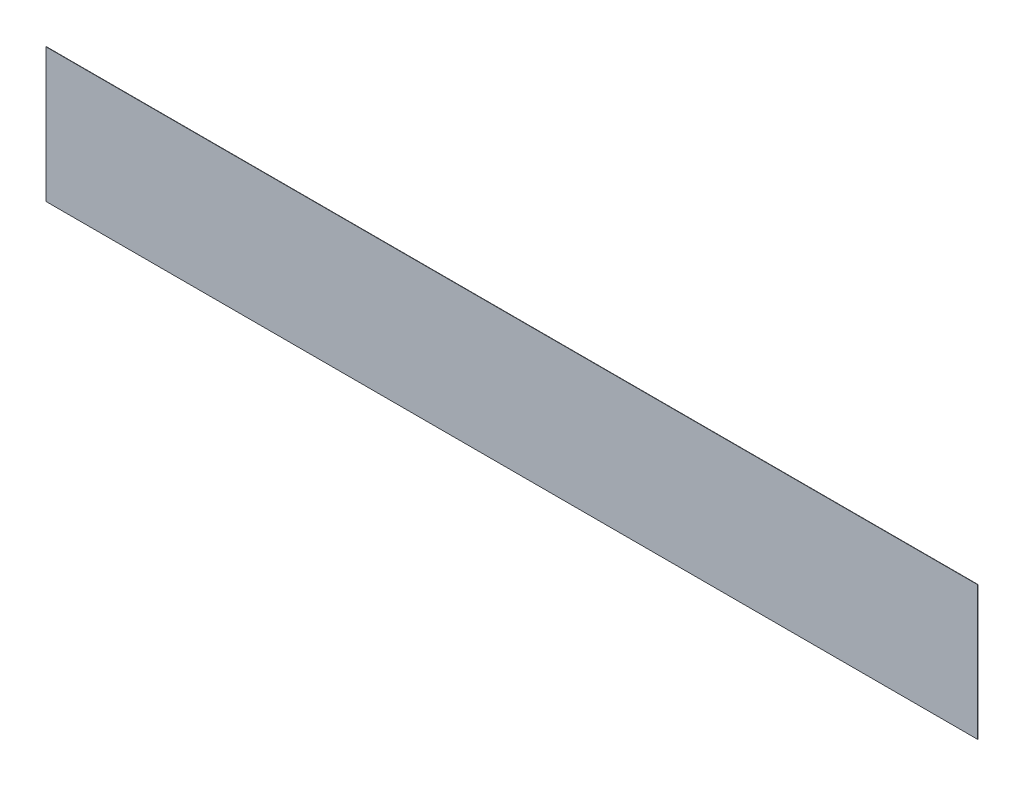
ISO-10303-21;
HEADER;
FILE_DESCRIPTION(('STEP AP214'),'2;1');
FILE_NAME('part.step','',(''),(''),'','','');
FILE_SCHEMA(('AUTOMOTIVE_DESIGN { 1 0 10303 214 1 1 1 1 }'));
ENDSEC;
DATA;
#1=APPLICATION_CONTEXT('core data for automotive mechanical design processes');
#2=APPLICATION_PROTOCOL_DEFINITION('international standard','automotive_design',2000,#1);
#3=PRODUCT_CONTEXT('',#1,'mechanical');
#4=PRODUCT('Part','Part','',(#3));
#5=PRODUCT_RELATED_PRODUCT_CATEGORY('part','',(#4));
#6=PRODUCT_DEFINITION_FORMATION('','',#4);
#7=PRODUCT_DEFINITION_CONTEXT('part definition',#1,'design');
#8=PRODUCT_DEFINITION('design','',#6,#7);
#9=PRODUCT_DEFINITION_SHAPE('','',#8);
#10=(LENGTH_UNIT() NAMED_UNIT(*) SI_UNIT(.MILLI.,.METRE.));
#11=(NAMED_UNIT(*) PLANE_ANGLE_UNIT() SI_UNIT($,.RADIAN.));
#12=(NAMED_UNIT(*) SI_UNIT($,.STERADIAN.) SOLID_ANGLE_UNIT());
#13=UNCERTAINTY_MEASURE_WITH_UNIT(LENGTH_MEASURE(1.E-05),#10,'distance_accuracy_value','');
#14=(GEOMETRIC_REPRESENTATION_CONTEXT(3) GLOBAL_UNCERTAINTY_ASSIGNED_CONTEXT((#13)) GLOBAL_UNIT_ASSIGNED_CONTEXT((#10,
#11,#12)) REPRESENTATION_CONTEXT('',''));
#15=CARTESIAN_POINT('',(0.,0.,0.));
#16=DIRECTION('',(0.,0.,1.));
#17=DIRECTION('',(1.,0.,0.));
#18=AXIS2_PLACEMENT_3D('',#15,#16,#17);
#19=CARTESIAN_POINT('',(0.,-9.78000000000001,0.05));
#20=DIRECTION('',(0.,1.,0.));
#21=DIRECTION('',(-1.,0.,0.));
#22=AXIS2_PLACEMENT_3D('',#19,#20,#21);
#23=PLANE('',#22);
#24=DIRECTION('',(1.,0.,0.));
#25=VECTOR('',#24,1.);
#26=CARTESIAN_POINT('',(0.,-9.78000000000001,0.));
#27=LINE('',#26,#25);
#28=CARTESIAN_POINT('',(-4.5,-9.78,0.));
#29=VERTEX_POINT('',#28);
#30=CARTESIAN_POINT('',(131.52,-9.77999999999999,0.));
#31=VERTEX_POINT('',#30);
#32=EDGE_CURVE('E100',#29,#31,#27,.T.);
#33=ORIENTED_EDGE('',*,*,#32,.T.);
#34=DIRECTION('',(0.,0.,-1.));
#35=VECTOR('',#34,1.);
#36=CARTESIAN_POINT('',(131.52,-9.77999999999999,0.05));
#37=LINE('',#36,#35);
#38=CARTESIAN_POINT('',(131.52,-9.77999999999999,0.05));
#39=VERTEX_POINT('',#38);
#40=EDGE_CURVE('E12',#39,#31,#37,.T.);
#41=ORIENTED_EDGE('',*,*,#40,.F.);
#42=DIRECTION('',(1.,0.,0.));
#43=VECTOR('',#42,1.);
#44=CARTESIAN_POINT('',(0.,-9.78000000000001,0.05));
#45=LINE('',#44,#43);
#46=CARTESIAN_POINT('',(-4.5,-9.78,0.05));
#47=VERTEX_POINT('',#46);
#48=EDGE_CURVE('E112',#47,#39,#45,.T.);
#49=ORIENTED_EDGE('',*,*,#48,.F.);
#50=DIRECTION('',(0.,0.,-1.));
#51=VECTOR('',#50,1.);
#52=CARTESIAN_POINT('',(-4.5,-9.78,0.05));
#53=LINE('',#52,#51);
#54=EDGE_CURVE('E66',#47,#29,#53,.T.);
#55=ORIENTED_EDGE('',*,*,#54,.T.);
#56=EDGE_LOOP('',(#33,#41,#49,#55));
#57=FACE_BOUND('',#56,.T.);
#58=ADVANCED_FACE('F62',(#57),#23,.F.);
#59=CARTESIAN_POINT('',(131.52,0.,0.05));
#60=DIRECTION('',(1.,0.,0.));
#61=DIRECTION('',(0.,0.,-1.));
#62=AXIS2_PLACEMENT_3D('',#59,#60,#61);
#63=PLANE('',#62);
#64=DIRECTION('',(0.,-1.,0.));
#65=VECTOR('',#64,1.);
#66=CARTESIAN_POINT('',(131.52,0.,0.));
#67=LINE('',#66,#65);
#68=CARTESIAN_POINT('',(131.52,9.78000000000001,0.));
#69=VERTEX_POINT('',#68);
#70=EDGE_CURVE('E113',#69,#31,#67,.T.);
#71=ORIENTED_EDGE('',*,*,#70,.F.);
#72=DIRECTION('',(0.,0.,-1.));
#73=VECTOR('',#72,1.);
#74=CARTESIAN_POINT('',(131.52,9.78000000000001,0.05));
#75=LINE('',#74,#73);
#76=CARTESIAN_POINT('',(131.52,9.78000000000001,0.05));
#77=VERTEX_POINT('',#76);
#78=EDGE_CURVE('E72',#77,#69,#75,.T.);
#79=ORIENTED_EDGE('',*,*,#78,.F.);
#80=DIRECTION('',(0.,-1.,0.));
#81=VECTOR('',#80,1.);
#82=CARTESIAN_POINT('',(131.52,0.,0.05));
#83=LINE('',#82,#81);
#84=EDGE_CURVE('E130',#77,#39,#83,.T.);
#85=ORIENTED_EDGE('',*,*,#84,.T.);
#86=ORIENTED_EDGE('',*,*,#40,.T.);
#87=EDGE_LOOP('',(#71,#79,#85,#86));
#88=FACE_BOUND('',#87,.T.);
#89=ADVANCED_FACE('F136',(#88),#63,.T.);
#90=CARTESIAN_POINT('',(0.,9.77999999999999,0.05));
#91=DIRECTION('',(0.,1.,0.));
#92=DIRECTION('',(-1.,0.,0.));
#93=AXIS2_PLACEMENT_3D('',#90,#91,#92);
#94=PLANE('',#93);
#95=DIRECTION('',(1.,0.,0.));
#96=VECTOR('',#95,1.);
#97=CARTESIAN_POINT('',(0.,9.77999999999999,0.));
#98=LINE('',#97,#96);
#99=CARTESIAN_POINT('',(-4.5,9.78,0.));
#100=VERTEX_POINT('',#99);
#101=EDGE_CURVE('E106',#100,#69,#98,.T.);
#102=ORIENTED_EDGE('',*,*,#101,.F.);
#103=DIRECTION('',(0.,0.,-1.));
#104=VECTOR('',#103,1.);
#105=CARTESIAN_POINT('',(-4.5,9.78,0.05));
#106=LINE('',#105,#104);
#107=CARTESIAN_POINT('',(-4.5,9.78,0.05));
#108=VERTEX_POINT('',#107);
#109=EDGE_CURVE('E110',#108,#100,#106,.T.);
#110=ORIENTED_EDGE('',*,*,#109,.F.);
#111=DIRECTION('',(1.,0.,0.));
#112=VECTOR('',#111,1.);
#113=CARTESIAN_POINT('',(0.,9.77999999999999,0.05));
#114=LINE('',#113,#112);
#115=EDGE_CURVE('E125',#108,#77,#114,.T.);
#116=ORIENTED_EDGE('',*,*,#115,.T.);
#117=ORIENTED_EDGE('',*,*,#78,.T.);
#118=EDGE_LOOP('',(#102,#110,#116,#117));
#119=FACE_BOUND('',#118,.T.);
#120=ADVANCED_FACE('F108',(#119),#94,.T.);
#121=CARTESIAN_POINT('',(0.,0.,0.05));
#122=DIRECTION('',(0.,0.,1.));
#123=DIRECTION('',(1.,0.,0.));
#124=AXIS2_PLACEMENT_3D('',#121,#122,#123);
#125=PLANE('',#124);
#126=ORIENTED_EDGE('',*,*,#48,.T.);
#127=ORIENTED_EDGE('',*,*,#84,.F.);
#128=ORIENTED_EDGE('',*,*,#115,.F.);
#129=DIRECTION('',(0.,-1.,0.));
#130=VECTOR('',#129,1.);
#131=CARTESIAN_POINT('',(-4.5,9.78,0.05));
#132=LINE('',#131,#130);
#133=EDGE_CURVE('E120',#108,#47,#132,.T.);
#134=ORIENTED_EDGE('',*,*,#133,.T.);
#135=EDGE_LOOP('',(#126,#127,#128,#134));
#136=FACE_BOUND('',#135,.T.);
#137=ADVANCED_FACE('F134',(#136),#125,.T.);
#138=CARTESIAN_POINT('',(0.,0.,0.));
#139=DIRECTION('',(0.,0.,1.));
#140=DIRECTION('',(1.,0.,0.));
#141=AXIS2_PLACEMENT_3D('',#138,#139,#140);
#142=PLANE('',#141);
#143=ORIENTED_EDGE('',*,*,#32,.F.);
#144=DIRECTION('',(0.,-1.,0.));
#145=VECTOR('',#144,1.);
#146=CARTESIAN_POINT('',(-4.5,9.78,0.));
#147=LINE('',#146,#145);
#148=EDGE_CURVE('E117',#100,#29,#147,.T.);
#149=ORIENTED_EDGE('',*,*,#148,.F.);
#150=ORIENTED_EDGE('',*,*,#101,.T.);
#151=ORIENTED_EDGE('',*,*,#70,.T.);
#152=EDGE_LOOP('',(#143,#149,#150,#151));
#153=FACE_BOUND('',#152,.T.);
#154=ADVANCED_FACE('F121',(#153),#142,.F.);
#155=CARTESIAN_POINT('',(-4.5,9.78,0.05));
#156=DIRECTION('',(1.,0.,0.));
#157=DIRECTION('',(0.,0.,-1.));
#158=AXIS2_PLACEMENT_3D('',#155,#156,#157);
#159=PLANE('',#158);
#160=ORIENTED_EDGE('',*,*,#148,.T.);
#161=ORIENTED_EDGE('',*,*,#54,.F.);
#162=ORIENTED_EDGE('',*,*,#133,.F.);
#163=ORIENTED_EDGE('',*,*,#109,.T.);
#164=EDGE_LOOP('',(#160,#161,#162,#163));
#165=FACE_BOUND('',#164,.T.);
#166=ADVANCED_FACE('F64',(#165),#159,.F.);
#167=CLOSED_SHELL('',(#58,#89,#120,#137,#154,#166));
#168=MANIFOLD_SOLID_BREP('B2',#167);
#169=ADVANCED_BREP_SHAPE_REPRESENTATION('',(#18,#168),#14);
#170=SHAPE_DEFINITION_REPRESENTATION(#9,#169);
ENDSEC;
END-ISO-10303-21;
